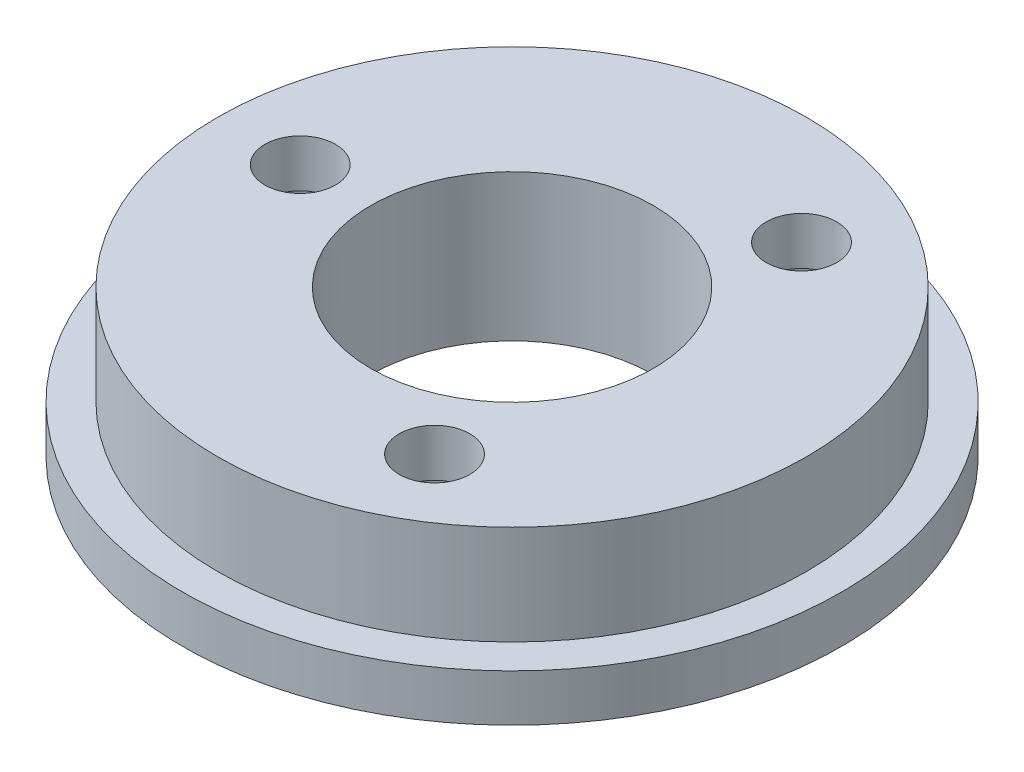
ISO-10303-21;
HEADER;
FILE_DESCRIPTION(('STEP AP214'),'2;1');
FILE_NAME('part.step','',(''),(''),'','','');
FILE_SCHEMA(('AUTOMOTIVE_DESIGN { 1 0 10303 214 1 1 1 1 }'));
ENDSEC;
DATA;
#1=APPLICATION_CONTEXT('core data for automotive mechanical design processes');
#2=APPLICATION_PROTOCOL_DEFINITION('international standard','automotive_design',2000,#1);
#3=PRODUCT_CONTEXT('',#1,'mechanical');
#4=PRODUCT('Part','Part','',(#3));
#5=PRODUCT_RELATED_PRODUCT_CATEGORY('part','',(#4));
#6=PRODUCT_DEFINITION_FORMATION('','',#4);
#7=PRODUCT_DEFINITION_CONTEXT('part definition',#1,'design');
#8=PRODUCT_DEFINITION('design','',#6,#7);
#9=PRODUCT_DEFINITION_SHAPE('','',#8);
#10=(LENGTH_UNIT() NAMED_UNIT(*) SI_UNIT(.MILLI.,.METRE.));
#11=(NAMED_UNIT(*) PLANE_ANGLE_UNIT() SI_UNIT($,.RADIAN.));
#12=(NAMED_UNIT(*) SI_UNIT($,.STERADIAN.) SOLID_ANGLE_UNIT());
#13=UNCERTAINTY_MEASURE_WITH_UNIT(LENGTH_MEASURE(1.E-05),#10,'distance_accuracy_value','');
#14=(GEOMETRIC_REPRESENTATION_CONTEXT(3) GLOBAL_UNCERTAINTY_ASSIGNED_CONTEXT((#13)) GLOBAL_UNIT_ASSIGNED_CONTEXT((#10,
#11,#12)) REPRESENTATION_CONTEXT('',''));
#15=CARTESIAN_POINT('',(0.,0.,0.));
#16=DIRECTION('',(0.,0.,1.));
#17=DIRECTION('',(1.,0.,0.));
#18=AXIS2_PLACEMENT_3D('',#15,#16,#17);
#19=CARTESIAN_POINT('',(0.,3.82356419291814,0.));
#20=DIRECTION('',(0.,1.,0.));
#21=DIRECTION('',(0.,0.,1.));
#22=AXIS2_PLACEMENT_3D('',#19,#20,#21);
#23=PLANE('',#22);
#24=CARTESIAN_POINT('',(0.,3.82356419291814,0.));
#25=DIRECTION('',(0.,1.,0.));
#26=DIRECTION('',(0.,0.,1.));
#27=AXIS2_PLACEMENT_3D('',#24,#25,#26);
#28=CIRCLE('',#27,6.);
#29=CARTESIAN_POINT('',(0.,3.82356419291814,6.));
#30=VERTEX_POINT('',#29);
#31=EDGE_CURVE('E42',#30,#30,#28,.F.);
#32=ORIENTED_EDGE('',*,*,#31,.T.);
#33=EDGE_LOOP('',(#32));
#34=FACE_BOUND('',#33,.T.);
#35=CARTESIAN_POINT('',(0.,3.82356419291814,0.));
#36=DIRECTION('',(0.,1.,0.));
#37=DIRECTION('',(0.,0.,1.));
#38=AXIS2_PLACEMENT_3D('',#35,#36,#37);
#39=CIRCLE('',#38,12.5);
#40=CARTESIAN_POINT('',(0.,3.82356419291814,12.5));
#41=VERTEX_POINT('',#40);
#42=EDGE_CURVE('E69',#41,#41,#39,.F.);
#43=ORIENTED_EDGE('',*,*,#42,.F.);
#44=EDGE_LOOP('',(#43));
#45=FACE_BOUND('',#44,.T.);
#46=CARTESIAN_POINT('',(-9.,3.82356419291814,0.));
#47=DIRECTION('',(0.,1.,0.));
#48=DIRECTION('',(0.,0.,1.));
#49=AXIS2_PLACEMENT_3D('',#46,#47,#48);
#50=CIRCLE('',#49,1.5);
#51=CARTESIAN_POINT('',(-9.,3.82356419291814,1.5));
#52=VERTEX_POINT('',#51);
#53=EDGE_CURVE('E73',#52,#52,#50,.T.);
#54=ORIENTED_EDGE('',*,*,#53,.F.);
#55=EDGE_LOOP('',(#54));
#56=FACE_BOUND('',#55,.T.);
#57=CARTESIAN_POINT('',(4.49999999999993,3.82356419291814,7.79422863405999));
#58=DIRECTION('',(0.,1.,0.));
#59=DIRECTION('',(0.,0.,1.));
#60=AXIS2_PLACEMENT_3D('',#57,#58,#59);
#61=CIRCLE('',#60,1.5);
#62=CARTESIAN_POINT('',(4.49999999999993,3.82356419291814,9.29422863405999));
#63=VERTEX_POINT('',#62);
#64=EDGE_CURVE('E76',#63,#63,#61,.T.);
#65=ORIENTED_EDGE('',*,*,#64,.F.);
#66=EDGE_LOOP('',(#65));
#67=FACE_BOUND('',#66,.T.);
#68=CARTESIAN_POINT('',(4.50000000000003,3.82356419291814,-7.79422863405993));
#69=DIRECTION('',(0.,1.,0.));
#70=DIRECTION('',(0.,0.,1.));
#71=AXIS2_PLACEMENT_3D('',#68,#69,#70);
#72=CIRCLE('',#71,1.5);
#73=CARTESIAN_POINT('',(4.50000000000003,3.82356419291814,-6.29422863405992));
#74=VERTEX_POINT('',#73);
#75=EDGE_CURVE('E78',#74,#74,#72,.T.);
#76=ORIENTED_EDGE('',*,*,#75,.F.);
#77=EDGE_LOOP('',(#76));
#78=FACE_BOUND('',#77,.T.);
#79=ADVANCED_FACE('F38',(#34,#45,#56,#67,#78),#23,.T.);
#80=CARTESIAN_POINT('',(0.,0.,0.));
#81=DIRECTION('',(0.,-1.,0.));
#82=DIRECTION('',(0.,0.,-1.));
#83=AXIS2_PLACEMENT_3D('',#80,#81,#82);
#84=CYLINDRICAL_SURFACE('',#83,14.);
#85=CARTESIAN_POINT('',(0.,-2.4,0.));
#86=DIRECTION('',(0.,-1.,0.));
#87=DIRECTION('',(0.,0.,-1.));
#88=AXIS2_PLACEMENT_3D('',#85,#86,#87);
#89=CIRCLE('',#88,14.);
#90=CARTESIAN_POINT('',(0.,-2.4,-14.));
#91=VERTEX_POINT('',#90);
#92=EDGE_CURVE('E166',#91,#91,#89,.T.);
#93=ORIENTED_EDGE('',*,*,#92,.F.);
#94=EDGE_LOOP('',(#93));
#95=FACE_BOUND('',#94,.T.);
#96=CARTESIAN_POINT('',(0.,-0.400000000000002,0.));
#97=DIRECTION('',(0.,-1.,0.));
#98=DIRECTION('',(0.,0.,-1.));
#99=AXIS2_PLACEMENT_3D('',#96,#97,#98);
#100=CIRCLE('',#99,14.);
#101=CARTESIAN_POINT('',(0.,-0.400000000000002,-14.));
#102=VERTEX_POINT('',#101);
#103=EDGE_CURVE('E168',#102,#102,#100,.T.);
#104=ORIENTED_EDGE('',*,*,#103,.T.);
#105=EDGE_LOOP('',(#104));
#106=FACE_BOUND('',#105,.T.);
#107=ADVANCED_FACE('F104',(#95,#106),#84,.T.);
#108=CARTESIAN_POINT('',(-12.5,-0.400000000000002,0.));
#109=DIRECTION('',(0.,-1.,0.));
#110=DIRECTION('',(0.,0.,-1.));
#111=AXIS2_PLACEMENT_3D('',#108,#109,#110);
#112=PLANE('',#111);
#113=ORIENTED_EDGE('',*,*,#103,.F.);
#114=EDGE_LOOP('',(#113));
#115=FACE_BOUND('',#114,.T.);
#116=CARTESIAN_POINT('',(0.,-0.400000000000002,0.));
#117=DIRECTION('',(0.,-1.,0.));
#118=DIRECTION('',(0.,0.,-1.));
#119=AXIS2_PLACEMENT_3D('',#116,#117,#118);
#120=CIRCLE('',#119,12.5);
#121=CARTESIAN_POINT('',(0.,-0.400000000000002,-12.5));
#122=VERTEX_POINT('',#121);
#123=EDGE_CURVE('E54',#122,#122,#120,.T.);
#124=ORIENTED_EDGE('',*,*,#123,.T.);
#125=EDGE_LOOP('',(#124));
#126=FACE_BOUND('',#125,.T.);
#127=ADVANCED_FACE('F106',(#115,#126),#112,.F.);
#128=CARTESIAN_POINT('',(0.,9.51,0.));
#129=DIRECTION('',(0.,1.,0.));
#130=DIRECTION('',(-1.,0.,0.));
#131=AXIS2_PLACEMENT_3D('',#128,#129,#130);
#132=CYLINDRICAL_SURFACE('',#131,12.5);
#133=ORIENTED_EDGE('',*,*,#123,.F.);
#134=EDGE_LOOP('',(#133));
#135=FACE_BOUND('',#134,.T.);
#136=ORIENTED_EDGE('',*,*,#42,.T.);
#137=EDGE_LOOP('',(#136));
#138=FACE_BOUND('',#137,.T.);
#139=ADVANCED_FACE('F40',(#135,#138),#132,.T.);
#140=CARTESIAN_POINT('',(4.50000000000003,1.8,-7.79422863405993));
#141=DIRECTION('',(0.,-1.,0.));
#142=DIRECTION('',(0.,0.,-1.));
#143=AXIS2_PLACEMENT_3D('',#140,#141,#142);
#144=CYLINDRICAL_SURFACE('',#143,2.25);
#145=CARTESIAN_POINT('',(4.50000000000003,1.8,-7.79422863405993));
#146=DIRECTION('',(0.,-1.,0.));
#147=DIRECTION('',(0.,0.,-1.));
#148=AXIS2_PLACEMENT_3D('',#145,#146,#147);
#149=CIRCLE('',#148,2.25);
#150=CARTESIAN_POINT('',(4.50000000000003,1.8,-10.0442286340599));
#151=VERTEX_POINT('',#150);
#152=EDGE_CURVE('E10',#151,#151,#149,.T.);
#153=ORIENTED_EDGE('',*,*,#152,.F.);
#154=EDGE_LOOP('',(#153));
#155=FACE_BOUND('',#154,.T.);
#156=CARTESIAN_POINT('',(4.50000000000003,-2.4,-7.79422863405993));
#157=DIRECTION('',(0.,-1.,0.));
#158=DIRECTION('',(0.,0.,-1.));
#159=AXIS2_PLACEMENT_3D('',#156,#157,#158);
#160=CIRCLE('',#159,2.25);
#161=CARTESIAN_POINT('',(4.50000000000003,-2.4,-10.0442286340599));
#162=VERTEX_POINT('',#161);
#163=EDGE_CURVE('E46',#162,#162,#160,.T.);
#164=ORIENTED_EDGE('',*,*,#163,.T.);
#165=EDGE_LOOP('',(#164));
#166=FACE_BOUND('',#165,.T.);
#167=ADVANCED_FACE('F125',(#155,#166),#144,.F.);
#168=CARTESIAN_POINT('',(4.49999999999993,1.8,7.79422863405999));
#169=DIRECTION('',(0.,-1.,0.));
#170=DIRECTION('',(0.,0.,-1.));
#171=AXIS2_PLACEMENT_3D('',#168,#169,#170);
#172=CYLINDRICAL_SURFACE('',#171,2.25);
#173=CARTESIAN_POINT('',(4.49999999999993,1.8,7.79422863405999));
#174=DIRECTION('',(0.,-1.,0.));
#175=DIRECTION('',(0.,0.,-1.));
#176=AXIS2_PLACEMENT_3D('',#173,#174,#175);
#177=CIRCLE('',#176,2.25);
#178=CARTESIAN_POINT('',(4.49999999999993,1.8,5.54422863405999));
#179=VERTEX_POINT('',#178);
#180=EDGE_CURVE('E51',#179,#179,#177,.T.);
#181=ORIENTED_EDGE('',*,*,#180,.F.);
#182=EDGE_LOOP('',(#181));
#183=FACE_BOUND('',#182,.T.);
#184=CARTESIAN_POINT('',(4.49999999999993,-2.4,7.79422863405999));
#185=DIRECTION('',(0.,-1.,0.));
#186=DIRECTION('',(0.,0.,-1.));
#187=AXIS2_PLACEMENT_3D('',#184,#185,#186);
#188=CIRCLE('',#187,2.25);
#189=CARTESIAN_POINT('',(4.49999999999993,-2.4,5.54422863405999));
#190=VERTEX_POINT('',#189);
#191=EDGE_CURVE('E59',#190,#190,#188,.T.);
#192=ORIENTED_EDGE('',*,*,#191,.T.);
#193=EDGE_LOOP('',(#192));
#194=FACE_BOUND('',#193,.T.);
#195=ADVANCED_FACE('F128',(#183,#194),#172,.F.);
#196=CARTESIAN_POINT('',(-9.,1.8,0.));
#197=DIRECTION('',(0.,-1.,0.));
#198=DIRECTION('',(0.,0.,-1.));
#199=AXIS2_PLACEMENT_3D('',#196,#197,#198);
#200=CYLINDRICAL_SURFACE('',#199,2.25);
#201=CARTESIAN_POINT('',(-9.,1.8,0.));
#202=DIRECTION('',(0.,-1.,0.));
#203=DIRECTION('',(0.,0.,-1.));
#204=AXIS2_PLACEMENT_3D('',#201,#202,#203);
#205=CIRCLE('',#204,2.25);
#206=CARTESIAN_POINT('',(-9.,1.8,-2.25));
#207=VERTEX_POINT('',#206);
#208=EDGE_CURVE('E65',#207,#207,#205,.T.);
#209=ORIENTED_EDGE('',*,*,#208,.F.);
#210=EDGE_LOOP('',(#209));
#211=FACE_BOUND('',#210,.T.);
#212=CARTESIAN_POINT('',(-9.,-2.4,0.));
#213=DIRECTION('',(0.,-1.,0.));
#214=DIRECTION('',(0.,0.,-1.));
#215=AXIS2_PLACEMENT_3D('',#212,#213,#214);
#216=CIRCLE('',#215,2.25);
#217=CARTESIAN_POINT('',(-9.,-2.4,-2.25));
#218=VERTEX_POINT('',#217);
#219=EDGE_CURVE('E62',#218,#218,#216,.T.);
#220=ORIENTED_EDGE('',*,*,#219,.T.);
#221=EDGE_LOOP('',(#220));
#222=FACE_BOUND('',#221,.T.);
#223=ADVANCED_FACE('F99',(#211,#222),#200,.F.);
#224=CARTESIAN_POINT('',(-6.,-2.4,0.));
#225=DIRECTION('',(0.,1.,0.));
#226=DIRECTION('',(0.,0.,1.));
#227=AXIS2_PLACEMENT_3D('',#224,#225,#226);
#228=PLANE('',#227);
#229=ORIENTED_EDGE('',*,*,#219,.F.);
#230=EDGE_LOOP('',(#229));
#231=FACE_BOUND('',#230,.T.);
#232=ORIENTED_EDGE('',*,*,#191,.F.);
#233=EDGE_LOOP('',(#232));
#234=FACE_BOUND('',#233,.T.);
#235=ORIENTED_EDGE('',*,*,#163,.F.);
#236=EDGE_LOOP('',(#235));
#237=FACE_BOUND('',#236,.T.);
#238=CARTESIAN_POINT('',(0.,-2.4,0.));
#239=DIRECTION('',(0.,-1.,0.));
#240=DIRECTION('',(0.,0.,-1.));
#241=AXIS2_PLACEMENT_3D('',#238,#239,#240);
#242=CIRCLE('',#241,6.);
#243=CARTESIAN_POINT('',(0.,-2.4,-6.));
#244=VERTEX_POINT('',#243);
#245=EDGE_CURVE('E72',#244,#244,#242,.T.);
#246=ORIENTED_EDGE('',*,*,#245,.F.);
#247=EDGE_LOOP('',(#246));
#248=FACE_BOUND('',#247,.T.);
#249=ORIENTED_EDGE('',*,*,#92,.T.);
#250=EDGE_LOOP('',(#249));
#251=FACE_BOUND('',#250,.T.);
#252=ADVANCED_FACE('F90',(#231,#234,#237,#248,#251),#228,.F.);
#253=CARTESIAN_POINT('',(0.,9.50999999999997,0.));
#254=DIRECTION('',(0.,-1.,0.));
#255=DIRECTION('',(1.,0.,0.));
#256=AXIS2_PLACEMENT_3D('',#253,#254,#255);
#257=CYLINDRICAL_SURFACE('',#256,6.);
#258=ORIENTED_EDGE('',*,*,#245,.T.);
#259=EDGE_LOOP('',(#258));
#260=FACE_BOUND('',#259,.T.);
#261=ORIENTED_EDGE('',*,*,#31,.F.);
#262=EDGE_LOOP('',(#261));
#263=FACE_BOUND('',#262,.T.);
#264=ADVANCED_FACE('F87',(#260,#263),#257,.F.);
#265=CARTESIAN_POINT('',(-9.,1.8,0.));
#266=DIRECTION('',(0.,-1.,0.));
#267=DIRECTION('',(0.,0.,-1.));
#268=AXIS2_PLACEMENT_3D('',#265,#266,#267);
#269=PLANE('',#268);
#270=CARTESIAN_POINT('',(-9.,1.8,0.));
#271=DIRECTION('',(0.,-1.,0.));
#272=DIRECTION('',(0.,0.,-1.));
#273=AXIS2_PLACEMENT_3D('',#270,#271,#272);
#274=CIRCLE('',#273,1.5);
#275=CARTESIAN_POINT('',(-9.,1.8,-1.5));
#276=VERTEX_POINT('',#275);
#277=EDGE_CURVE('E68',#276,#276,#274,.T.);
#278=ORIENTED_EDGE('',*,*,#277,.F.);
#279=EDGE_LOOP('',(#278));
#280=FACE_BOUND('',#279,.T.);
#281=ORIENTED_EDGE('',*,*,#208,.T.);
#282=EDGE_LOOP('',(#281));
#283=FACE_BOUND('',#282,.T.);
#284=ADVANCED_FACE('F89',(#280,#283),#269,.T.);
#285=CARTESIAN_POINT('',(-9.,20.9846888989347,0.));
#286=DIRECTION('',(0.,-1.,0.));
#287=DIRECTION('',(0.,0.,-1.));
#288=AXIS2_PLACEMENT_3D('',#285,#286,#287);
#289=CYLINDRICAL_SURFACE('',#288,1.5);
#290=ORIENTED_EDGE('',*,*,#277,.T.);
#291=EDGE_LOOP('',(#290));
#292=FACE_BOUND('',#291,.T.);
#293=ORIENTED_EDGE('',*,*,#53,.T.);
#294=EDGE_LOOP('',(#293));
#295=FACE_BOUND('',#294,.T.);
#296=ADVANCED_FACE('F96',(#292,#295),#289,.F.);
#297=CARTESIAN_POINT('',(4.49999999999993,1.8,7.79422863405999));
#298=DIRECTION('',(0.,-1.,0.));
#299=DIRECTION('',(0.,0.,-1.));
#300=AXIS2_PLACEMENT_3D('',#297,#298,#299);
#301=PLANE('',#300);
#302=CARTESIAN_POINT('',(4.49999999999993,1.8,7.79422863405999));
#303=DIRECTION('',(0.,-1.,0.));
#304=DIRECTION('',(0.,0.,-1.));
#305=AXIS2_PLACEMENT_3D('',#302,#303,#304);
#306=CIRCLE('',#305,1.5);
#307=CARTESIAN_POINT('',(4.49999999999993,1.8,6.29422863405999));
#308=VERTEX_POINT('',#307);
#309=EDGE_CURVE('E158',#308,#308,#306,.T.);
#310=ORIENTED_EDGE('',*,*,#309,.F.);
#311=EDGE_LOOP('',(#310));
#312=FACE_BOUND('',#311,.T.);
#313=ORIENTED_EDGE('',*,*,#180,.T.);
#314=EDGE_LOOP('',(#313));
#315=FACE_BOUND('',#314,.T.);
#316=ADVANCED_FACE('F130',(#312,#315),#301,.T.);
#317=CARTESIAN_POINT('',(4.49999999999993,20.9846888989347,7.79422863405999));
#318=DIRECTION('',(0.,-1.,0.));
#319=DIRECTION('',(0.,0.,-1.));
#320=AXIS2_PLACEMENT_3D('',#317,#318,#319);
#321=CYLINDRICAL_SURFACE('',#320,1.5);
#322=ORIENTED_EDGE('',*,*,#309,.T.);
#323=EDGE_LOOP('',(#322));
#324=FACE_BOUND('',#323,.T.);
#325=ORIENTED_EDGE('',*,*,#64,.T.);
#326=EDGE_LOOP('',(#325));
#327=FACE_BOUND('',#326,.T.);
#328=ADVANCED_FACE('F123',(#324,#327),#321,.F.);
#329=CARTESIAN_POINT('',(4.50000000000003,1.8,-7.79422863405993));
#330=DIRECTION('',(0.,-1.,0.));
#331=DIRECTION('',(0.,0.,-1.));
#332=AXIS2_PLACEMENT_3D('',#329,#330,#331);
#333=PLANE('',#332);
#334=CARTESIAN_POINT('',(4.50000000000003,1.8,-7.79422863405993));
#335=DIRECTION('',(0.,-1.,0.));
#336=DIRECTION('',(0.,0.,-1.));
#337=AXIS2_PLACEMENT_3D('',#334,#335,#336);
#338=CIRCLE('',#337,1.5);
#339=CARTESIAN_POINT('',(4.50000000000003,1.8,-9.29422863405993));
#340=VERTEX_POINT('',#339);
#341=EDGE_CURVE('E161',#340,#340,#338,.T.);
#342=ORIENTED_EDGE('',*,*,#341,.F.);
#343=EDGE_LOOP('',(#342));
#344=FACE_BOUND('',#343,.T.);
#345=ORIENTED_EDGE('',*,*,#152,.T.);
#346=EDGE_LOOP('',(#345));
#347=FACE_BOUND('',#346,.T.);
#348=ADVANCED_FACE('F120',(#344,#347),#333,.T.);
#349=CARTESIAN_POINT('',(4.50000000000003,20.9846888989347,-7.79422863405993));
#350=DIRECTION('',(0.,-1.,0.));
#351=DIRECTION('',(0.,0.,-1.));
#352=AXIS2_PLACEMENT_3D('',#349,#350,#351);
#353=CYLINDRICAL_SURFACE('',#352,1.5);
#354=ORIENTED_EDGE('',*,*,#341,.T.);
#355=EDGE_LOOP('',(#354));
#356=FACE_BOUND('',#355,.T.);
#357=ORIENTED_EDGE('',*,*,#75,.T.);
#358=EDGE_LOOP('',(#357));
#359=FACE_BOUND('',#358,.T.);
#360=ADVANCED_FACE('F116',(#356,#359),#353,.F.);
#361=CLOSED_SHELL('',(#79,#107,#127,#139,#167,#195,#223,#252,#264,#284,#296,#316,#328,#348,#360));
#362=MANIFOLD_SOLID_BREP('B2',#361);
#363=ADVANCED_BREP_SHAPE_REPRESENTATION('',(#18,#362),#14);
#364=SHAPE_DEFINITION_REPRESENTATION(#9,#363);
ENDSEC;
END-ISO-10303-21;
